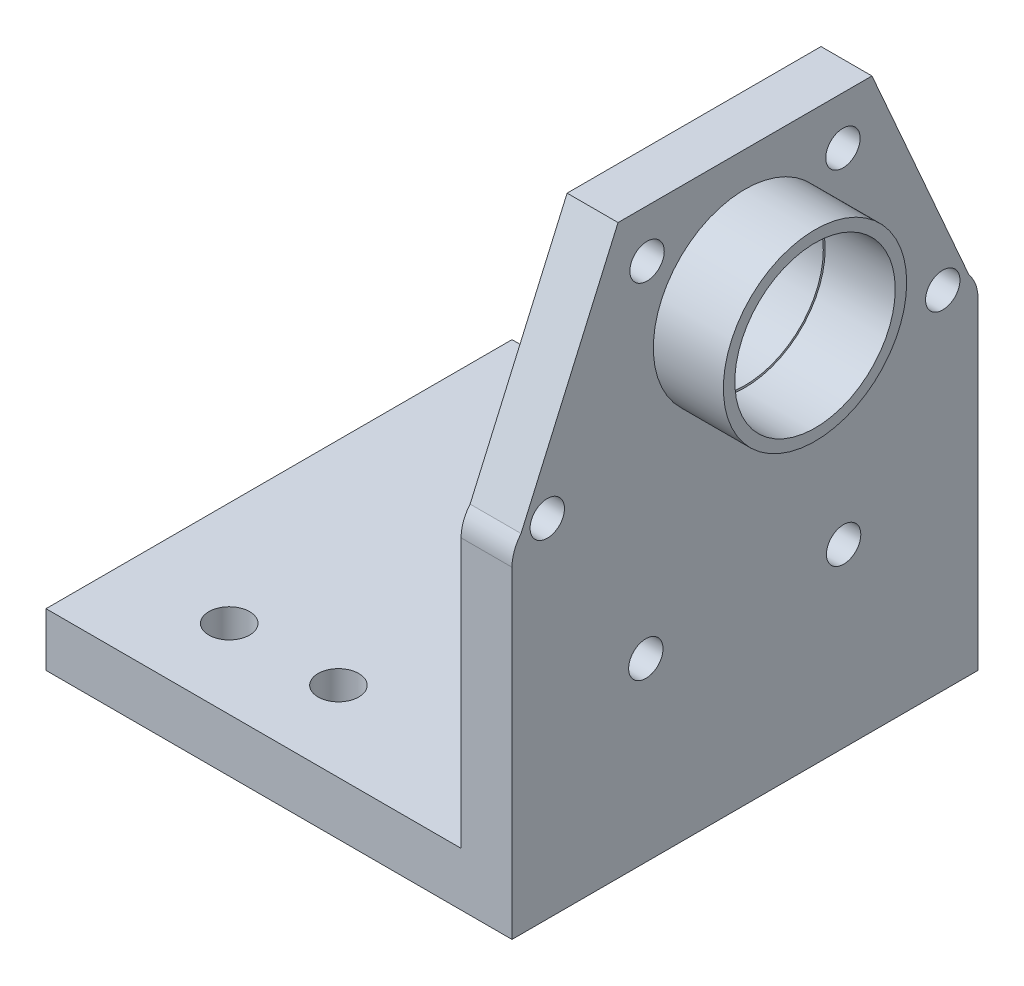
ISO-10303-21;
HEADER;
FILE_DESCRIPTION(('STEP AP214'),'2;1');
FILE_NAME('part.step','',(''),(''),'','','');
FILE_SCHEMA(('AUTOMOTIVE_DESIGN { 1 0 10303 214 1 1 1 1 }'));
ENDSEC;
DATA;
#1=APPLICATION_CONTEXT('core data for automotive mechanical design processes');
#2=APPLICATION_PROTOCOL_DEFINITION('international standard','automotive_design',2000,#1);
#3=PRODUCT_CONTEXT('',#1,'mechanical');
#4=PRODUCT('Part','Part','',(#3));
#5=PRODUCT_RELATED_PRODUCT_CATEGORY('part','',(#4));
#6=PRODUCT_DEFINITION_FORMATION('','',#4);
#7=PRODUCT_DEFINITION_CONTEXT('part definition',#1,'design');
#8=PRODUCT_DEFINITION('design','',#6,#7);
#9=PRODUCT_DEFINITION_SHAPE('','',#8);
#10=(LENGTH_UNIT() NAMED_UNIT(*) SI_UNIT(.MILLI.,.METRE.));
#11=(NAMED_UNIT(*) PLANE_ANGLE_UNIT() SI_UNIT($,.RADIAN.));
#12=(NAMED_UNIT(*) SI_UNIT($,.STERADIAN.) SOLID_ANGLE_UNIT());
#13=UNCERTAINTY_MEASURE_WITH_UNIT(LENGTH_MEASURE(1.E-05),#10,'distance_accuracy_value','');
#14=(GEOMETRIC_REPRESENTATION_CONTEXT(3) GLOBAL_UNCERTAINTY_ASSIGNED_CONTEXT((#13)) GLOBAL_UNIT_ASSIGNED_CONTEXT((#10,
#11,#12)) REPRESENTATION_CONTEXT('',''));
#15=CARTESIAN_POINT('',(0.,0.,0.));
#16=DIRECTION('',(0.,0.,1.));
#17=DIRECTION('',(1.,0.,0.));
#18=AXIS2_PLACEMENT_3D('',#15,#16,#17);
#19=CARTESIAN_POINT('',(18.3,-4.,18.3));
#20=DIRECTION('',(1.,0.,0.));
#21=DIRECTION('',(0.,0.,-1.));
#22=AXIS2_PLACEMENT_3D('',#19,#20,#21);
#23=PLANE('',#22);
#24=CARTESIAN_POINT('',(18.3,30.6829031479731,0.));
#25=DIRECTION('',(1.,0.,0.));
#26=DIRECTION('',(0.,0.,-1.));
#27=AXIS2_PLACEMENT_3D('',#24,#25,#26);
#28=CIRCLE('',#27,7.2);
#29=CARTESIAN_POINT('',(18.3,30.6829031479731,-7.2));
#30=VERTEX_POINT('',#29);
#31=EDGE_CURVE('E376',#30,#30,#28,.T.);
#32=ORIENTED_EDGE('',*,*,#31,.F.);
#33=EDGE_LOOP('',(#32));
#34=FACE_BOUND('',#33,.T.);
#35=DIRECTION('',(0.,1.,0.));
#36=VECTOR('',#35,1.);
#37=CARTESIAN_POINT('',(18.3,-4.,-18.3));
#38=LINE('',#37,#36);
#39=CARTESIAN_POINT('',(18.3,-4.,-18.3));
#40=VERTEX_POINT('',#39);
#41=CARTESIAN_POINT('',(18.3,21.3190166297817,-18.3));
#42=VERTEX_POINT('',#41);
#43=EDGE_CURVE('E226',#40,#42,#38,.T.);
#44=ORIENTED_EDGE('',*,*,#43,.T.);
#45=CARTESIAN_POINT('',(18.3,21.3190166297817,-15.3));
#46=DIRECTION('',(1.,0.,0.));
#47=DIRECTION('',(0.,0.,-1.));
#48=AXIS2_PLACEMENT_3D('',#45,#46,#47);
#49=CIRCLE('',#48,3.);
#50=CARTESIAN_POINT('',(18.3,23.2570443214554,-17.5899887917424));
#51=VERTEX_POINT('',#50);
#52=EDGE_CURVE('E47',#42,#51,#49,.T.);
#53=ORIENTED_EDGE('',*,*,#52,.T.);
#54=DIRECTION('',(0.,-0.915557873016181,-0.402186251826298));
#55=VECTOR('',#54,1.);
#56=CARTESIAN_POINT('',(18.3,23.2570443214554,-17.5899887917424));
#57=LINE('',#56,#55);
#58=CARTESIAN_POINT('',(18.3,40.6,-9.97157542267274));
#59=VERTEX_POINT('',#58);
#60=EDGE_CURVE('E141',#59,#51,#57,.T.);
#61=ORIENTED_EDGE('',*,*,#60,.F.);
#62=DIRECTION('',(0.,0.,-1.));
#63=VECTOR('',#62,1.);
#64=CARTESIAN_POINT('',(18.3,40.6,18.3));
#65=LINE('',#64,#63);
#66=CARTESIAN_POINT('',(18.3,40.6,9.97157542267274));
#67=VERTEX_POINT('',#66);
#68=EDGE_CURVE('E140',#67,#59,#65,.T.);
#69=ORIENTED_EDGE('',*,*,#68,.F.);
#70=DIRECTION('',(0.,0.915557873016181,-0.402186251826298));
#71=VECTOR('',#70,1.);
#72=CARTESIAN_POINT('',(18.3,36.8329031479731,11.6263856840843));
#73=LINE('',#72,#71);
#74=CARTESIAN_POINT('',(18.3,23.2570443214554,17.5899887917424));
#75=VERTEX_POINT('',#74);
#76=EDGE_CURVE('E129',#75,#67,#73,.T.);
#77=ORIENTED_EDGE('',*,*,#76,.F.);
#78=CARTESIAN_POINT('',(18.3,21.3190166297817,15.3));
#79=DIRECTION('',(1.,0.,0.));
#80=DIRECTION('',(0.,0.,-1.));
#81=AXIS2_PLACEMENT_3D('',#78,#79,#80);
#82=CIRCLE('',#81,3.);
#83=CARTESIAN_POINT('',(18.3,21.3190166297817,18.3));
#84=VERTEX_POINT('',#83);
#85=EDGE_CURVE('E115',#75,#84,#82,.T.);
#86=ORIENTED_EDGE('',*,*,#85,.T.);
#87=DIRECTION('',(0.,1.,0.));
#88=VECTOR('',#87,1.);
#89=CARTESIAN_POINT('',(18.3,-4.,18.3));
#90=LINE('',#89,#88);
#91=CARTESIAN_POINT('',(18.3,-4.,18.3));
#92=VERTEX_POINT('',#91);
#93=EDGE_CURVE('E228',#92,#84,#90,.T.);
#94=ORIENTED_EDGE('',*,*,#93,.F.);
#95=DIRECTION('',(0.,0.,-1.));
#96=VECTOR('',#95,1.);
#97=CARTESIAN_POINT('',(18.3,-4.,18.3));
#98=LINE('',#97,#96);
#99=EDGE_CURVE('E217',#92,#40,#98,.T.);
#100=ORIENTED_EDGE('',*,*,#99,.T.);
#101=EDGE_LOOP('',(#44,#53,#61,#69,#77,#86,#94,#100));
#102=FACE_BOUND('',#101,.T.);
#103=CARTESIAN_POINT('',(18.3,9.85104244990388,7.79001879418784));
#104=DIRECTION('',(1.,0.,0.));
#105=DIRECTION('',(0.,0.,-1.));
#106=AXIS2_PLACEMENT_3D('',#103,#104,#105);
#107=CIRCLE('',#106,1.35);
#108=CARTESIAN_POINT('',(18.3,9.85104244990388,6.44001879418784));
#109=VERTEX_POINT('',#108);
#110=EDGE_CURVE('E187',#109,#109,#107,.T.);
#111=ORIENTED_EDGE('',*,*,#110,.F.);
#112=EDGE_LOOP('',(#111));
#113=FACE_BOUND('',#112,.T.);
#114=CARTESIAN_POINT('',(18.3,9.85104244990387,-7.74523523434163));
#115=DIRECTION('',(1.,0.,0.));
#116=DIRECTION('',(0.,0.,-1.));
#117=AXIS2_PLACEMENT_3D('',#114,#115,#116);
#118=CIRCLE('',#117,1.35);
#119=CARTESIAN_POINT('',(18.3,9.85104244990387,-9.09523523434163));
#120=VERTEX_POINT('',#119);
#121=EDGE_CURVE('E184',#120,#120,#118,.T.);
#122=ORIENTED_EDGE('',*,*,#121,.F.);
#123=EDGE_LOOP('',(#122));
#124=FACE_BOUND('',#123,.T.);
#125=CARTESIAN_POINT('',(18.3,23.2570443214554,-15.5299775834848));
#126=DIRECTION('',(1.,0.,0.));
#127=DIRECTION('',(0.,0.,-1.));
#128=AXIS2_PLACEMENT_3D('',#125,#126,#127);
#129=CIRCLE('',#128,1.35);
#130=CARTESIAN_POINT('',(18.3,23.2570443214554,-16.8799775834848));
#131=VERTEX_POINT('',#130);
#132=EDGE_CURVE('E181',#131,#131,#129,.T.);
#133=ORIENTED_EDGE('',*,*,#132,.F.);
#134=EDGE_LOOP('',(#133));
#135=FACE_BOUND('',#134,.T.);
#136=CARTESIAN_POINT('',(18.3,36.8329031479731,7.69195183551449));
#137=DIRECTION('',(1.,0.,0.));
#138=DIRECTION('',(0.,0.,-1.));
#139=AXIS2_PLACEMENT_3D('',#136,#137,#138);
#140=CIRCLE('',#139,1.35);
#141=CARTESIAN_POINT('',(18.3,36.8329031479731,6.34195183551449));
#142=VERTEX_POINT('',#141);
#143=EDGE_CURVE('E171',#142,#142,#140,.T.);
#144=ORIENTED_EDGE('',*,*,#143,.F.);
#145=EDGE_LOOP('',(#144));
#146=FACE_BOUND('',#145,.T.);
#147=CARTESIAN_POINT('',(18.3,23.2570443214554,15.5299775834848));
#148=DIRECTION('',(1.,0.,0.));
#149=DIRECTION('',(0.,0.,-1.));
#150=AXIS2_PLACEMENT_3D('',#147,#148,#149);
#151=CIRCLE('',#150,1.35);
#152=CARTESIAN_POINT('',(18.3,23.2570443214554,14.1799775834848));
#153=VERTEX_POINT('',#152);
#154=EDGE_CURVE('E175',#153,#153,#151,.T.);
#155=ORIENTED_EDGE('',*,*,#154,.F.);
#156=EDGE_LOOP('',(#155));
#157=FACE_BOUND('',#156,.T.);
#158=CARTESIAN_POINT('',(18.3,36.8329031479731,-7.69195183551449));
#159=DIRECTION('',(1.,0.,0.));
#160=DIRECTION('',(0.,0.,-1.));
#161=AXIS2_PLACEMENT_3D('',#158,#159,#160);
#162=CIRCLE('',#161,1.35);
#163=CARTESIAN_POINT('',(18.3,36.8329031479731,-9.04195183551449));
#164=VERTEX_POINT('',#163);
#165=EDGE_CURVE('E178',#164,#164,#162,.F.);
#166=ORIENTED_EDGE('',*,*,#165,.T.);
#167=EDGE_LOOP('',(#166));
#168=FACE_BOUND('',#167,.T.);
#169=ADVANCED_FACE('F39',(#34,#102,#113,#124,#135,#146,#157,#168),#23,.T.);
#170=CARTESIAN_POINT('',(14.3,0.200000000000006,-18.3));
#171=DIRECTION('',(1.,0.,0.));
#172=DIRECTION('',(0.,0.,-1.));
#173=AXIS2_PLACEMENT_3D('',#170,#171,#172);
#174=PLANE('',#173);
#175=CARTESIAN_POINT('',(14.3,9.85104244990388,7.79001879418784));
#176=DIRECTION('',(1.,0.,0.));
#177=DIRECTION('',(0.,0.,-1.));
#178=AXIS2_PLACEMENT_3D('',#175,#176,#177);
#179=CIRCLE('',#178,1.35);
#180=CARTESIAN_POINT('',(14.3,9.85104244990388,6.44001879418784));
#181=VERTEX_POINT('',#180);
#182=EDGE_CURVE('E205',#181,#181,#179,.T.);
#183=ORIENTED_EDGE('',*,*,#182,.T.);
#184=EDGE_LOOP('',(#183));
#185=FACE_BOUND('',#184,.T.);
#186=CARTESIAN_POINT('',(14.3,9.85104244990387,-7.74523523434163));
#187=DIRECTION('',(1.,0.,0.));
#188=DIRECTION('',(0.,0.,-1.));
#189=AXIS2_PLACEMENT_3D('',#186,#187,#188);
#190=CIRCLE('',#189,1.35);
#191=CARTESIAN_POINT('',(14.3,9.85104244990387,-9.09523523434163));
#192=VERTEX_POINT('',#191);
#193=EDGE_CURVE('E246',#192,#192,#190,.T.);
#194=ORIENTED_EDGE('',*,*,#193,.T.);
#195=EDGE_LOOP('',(#194));
#196=FACE_BOUND('',#195,.T.);
#197=CARTESIAN_POINT('',(14.3,23.2570443214554,-15.5299775834848));
#198=DIRECTION('',(1.,0.,0.));
#199=DIRECTION('',(0.,0.,-1.));
#200=AXIS2_PLACEMENT_3D('',#197,#198,#199);
#201=CIRCLE('',#200,1.35);
#202=CARTESIAN_POINT('',(14.3,23.2570443214554,-16.8799775834848));
#203=VERTEX_POINT('',#202);
#204=EDGE_CURVE('E243',#203,#203,#201,.T.);
#205=ORIENTED_EDGE('',*,*,#204,.T.);
#206=EDGE_LOOP('',(#205));
#207=FACE_BOUND('',#206,.T.);
#208=CARTESIAN_POINT('',(14.3,23.2570443214554,15.5299775834848));
#209=DIRECTION('',(1.,0.,0.));
#210=DIRECTION('',(0.,0.,-1.));
#211=AXIS2_PLACEMENT_3D('',#208,#209,#210);
#212=CIRCLE('',#211,1.35);
#213=CARTESIAN_POINT('',(14.3,23.2570443214554,14.1799775834848));
#214=VERTEX_POINT('',#213);
#215=EDGE_CURVE('E237',#214,#214,#212,.T.);
#216=ORIENTED_EDGE('',*,*,#215,.T.);
#217=EDGE_LOOP('',(#216));
#218=FACE_BOUND('',#217,.T.);
#219=CARTESIAN_POINT('',(14.3,36.8329031479731,7.69195183551449));
#220=DIRECTION('',(1.,0.,0.));
#221=DIRECTION('',(0.,0.,-1.));
#222=AXIS2_PLACEMENT_3D('',#219,#220,#221);
#223=CIRCLE('',#222,1.35);
#224=CARTESIAN_POINT('',(14.3,36.8329031479731,6.34195183551449));
#225=VERTEX_POINT('',#224);
#226=EDGE_CURVE('E234',#225,#225,#223,.T.);
#227=ORIENTED_EDGE('',*,*,#226,.T.);
#228=EDGE_LOOP('',(#227));
#229=FACE_BOUND('',#228,.T.);
#230=CARTESIAN_POINT('',(14.3,30.6829031479731,0.));
#231=DIRECTION('',(1.,0.,0.));
#232=DIRECTION('',(0.,0.,-1.));
#233=AXIS2_PLACEMENT_3D('',#230,#231,#232);
#234=CIRCLE('',#233,6.15);
#235=CARTESIAN_POINT('',(14.3,30.6829031479731,-6.15));
#236=VERTEX_POINT('',#235);
#237=EDGE_CURVE('E174',#236,#236,#234,.T.);
#238=ORIENTED_EDGE('',*,*,#237,.T.);
#239=EDGE_LOOP('',(#238));
#240=FACE_BOUND('',#239,.T.);
#241=DIRECTION('',(0.,-0.915557873016181,-0.402186251826298));
#242=VECTOR('',#241,1.);
#243=CARTESIAN_POINT('',(14.3,3.66812037377902,-26.1950110759942));
#244=LINE('',#243,#242);
#245=CARTESIAN_POINT('',(14.3,40.6,-9.97157542267274));
#246=VERTEX_POINT('',#245);
#247=CARTESIAN_POINT('',(14.3,23.2570443214554,-17.5899887917424));
#248=VERTEX_POINT('',#247);
#249=EDGE_CURVE('E150',#246,#248,#244,.T.);
#250=ORIENTED_EDGE('',*,*,#249,.T.);
#251=CARTESIAN_POINT('',(14.3,21.3190166297817,-15.3));
#252=DIRECTION('',(1.,0.,0.));
#253=DIRECTION('',(0.,0.,-1.));
#254=AXIS2_PLACEMENT_3D('',#251,#252,#253);
#255=CIRCLE('',#254,3.);
#256=CARTESIAN_POINT('',(14.3,21.3190166297817,-18.3));
#257=VERTEX_POINT('',#256);
#258=EDGE_CURVE('E11',#248,#257,#255,.F.);
#259=ORIENTED_EDGE('',*,*,#258,.T.);
#260=DIRECTION('',(0.,1.,0.));
#261=VECTOR('',#260,1.);
#262=CARTESIAN_POINT('',(14.3,0.200000000000006,-18.3));
#263=LINE('',#262,#261);
#264=CARTESIAN_POINT('',(14.3,0.200000000000006,-18.3));
#265=VERTEX_POINT('',#264);
#266=EDGE_CURVE('E206',#265,#257,#263,.T.);
#267=ORIENTED_EDGE('',*,*,#266,.F.);
#268=DIRECTION('',(0.,0.,-1.));
#269=VECTOR('',#268,1.);
#270=CARTESIAN_POINT('',(14.3,0.200000000000006,-18.3));
#271=LINE('',#270,#269);
#272=CARTESIAN_POINT('',(14.3,0.200000000000006,18.3));
#273=VERTEX_POINT('',#272);
#274=EDGE_CURVE('E197',#273,#265,#271,.T.);
#275=ORIENTED_EDGE('',*,*,#274,.F.);
#276=DIRECTION('',(0.,1.,0.));
#277=VECTOR('',#276,1.);
#278=CARTESIAN_POINT('',(14.3,0.200000000000006,18.3));
#279=LINE('',#278,#277);
#280=CARTESIAN_POINT('',(14.3,21.3190166297817,18.3));
#281=VERTEX_POINT('',#280);
#282=EDGE_CURVE('E202',#273,#281,#279,.T.);
#283=ORIENTED_EDGE('',*,*,#282,.T.);
#284=CARTESIAN_POINT('',(14.3,21.3190166297817,15.3));
#285=DIRECTION('',(1.,0.,0.));
#286=DIRECTION('',(0.,0.,-1.));
#287=AXIS2_PLACEMENT_3D('',#284,#285,#286);
#288=CIRCLE('',#287,3.);
#289=CARTESIAN_POINT('',(14.3,23.2570443214554,17.5899887917424));
#290=VERTEX_POINT('',#289);
#291=EDGE_CURVE('E262',#281,#290,#288,.F.);
#292=ORIENTED_EDGE('',*,*,#291,.T.);
#293=DIRECTION('',(0.,0.915557873016181,-0.402186251826298));
#294=VECTOR('',#293,1.);
#295=CARTESIAN_POINT('',(14.3,17.1451476613698,20.2748226856082));
#296=LINE('',#295,#294);
#297=CARTESIAN_POINT('',(14.3,40.6,9.97157542267274));
#298=VERTEX_POINT('',#297);
#299=EDGE_CURVE('E132',#290,#298,#296,.T.);
#300=ORIENTED_EDGE('',*,*,#299,.T.);
#301=DIRECTION('',(0.,0.,-1.));
#302=VECTOR('',#301,1.);
#303=CARTESIAN_POINT('',(14.3,40.6,-18.3));
#304=LINE('',#303,#302);
#305=EDGE_CURVE('E194',#298,#246,#304,.T.);
#306=ORIENTED_EDGE('',*,*,#305,.T.);
#307=EDGE_LOOP('',(#250,#259,#267,#275,#283,#292,#300,#306));
#308=FACE_BOUND('',#307,.T.);
#309=CARTESIAN_POINT('',(14.3,36.8329031479731,-7.69195183551449));
#310=DIRECTION('',(1.,0.,0.));
#311=DIRECTION('',(0.,0.,-1.));
#312=AXIS2_PLACEMENT_3D('',#309,#310,#311);
#313=CIRCLE('',#312,1.35);
#314=CARTESIAN_POINT('',(14.3,36.8329031479731,-9.04195183551449));
#315=VERTEX_POINT('',#314);
#316=EDGE_CURVE('E240',#315,#315,#313,.F.);
#317=ORIENTED_EDGE('',*,*,#316,.F.);
#318=EDGE_LOOP('',(#317));
#319=FACE_BOUND('',#318,.T.);
#320=ADVANCED_FACE('F271',(#185,#196,#207,#218,#229,#240,#308,#319),#174,.F.);
#321=CARTESIAN_POINT('',(-18.3,-4.,18.3));
#322=DIRECTION('',(-1.,0.,0.));
#323=DIRECTION('',(0.,0.,1.));
#324=AXIS2_PLACEMENT_3D('',#321,#322,#323);
#325=PLANE('',#324);
#326=DIRECTION('',(0.,1.,0.));
#327=VECTOR('',#326,1.);
#328=CARTESIAN_POINT('',(-18.3,-4.,18.3));
#329=LINE('',#328,#327);
#330=CARTESIAN_POINT('',(-18.3,-4.,18.3));
#331=VERTEX_POINT('',#330);
#332=CARTESIAN_POINT('',(-18.3,0.200000000000006,18.3));
#333=VERTEX_POINT('',#332);
#334=EDGE_CURVE('E223',#331,#333,#329,.T.);
#335=ORIENTED_EDGE('',*,*,#334,.T.);
#336=DIRECTION('',(0.,0.,1.));
#337=VECTOR('',#336,1.);
#338=CARTESIAN_POINT('',(-18.3,0.200000000000006,-18.3));
#339=LINE('',#338,#337);
#340=CARTESIAN_POINT('',(-18.3,0.200000000000006,-18.3));
#341=VERTEX_POINT('',#340);
#342=EDGE_CURVE('E191',#341,#333,#339,.T.);
#343=ORIENTED_EDGE('',*,*,#342,.F.);
#344=DIRECTION('',(0.,1.,0.));
#345=VECTOR('',#344,1.);
#346=CARTESIAN_POINT('',(-18.3,-4.,-18.3));
#347=LINE('',#346,#345);
#348=CARTESIAN_POINT('',(-18.3,-4.,-18.3));
#349=VERTEX_POINT('',#348);
#350=EDGE_CURVE('E124',#349,#341,#347,.T.);
#351=ORIENTED_EDGE('',*,*,#350,.F.);
#352=DIRECTION('',(0.,0.,1.));
#353=VECTOR('',#352,1.);
#354=CARTESIAN_POINT('',(-18.3,-4.,18.3));
#355=LINE('',#354,#353);
#356=EDGE_CURVE('E211',#349,#331,#355,.T.);
#357=ORIENTED_EDGE('',*,*,#356,.T.);
#358=EDGE_LOOP('',(#335,#343,#351,#357));
#359=FACE_BOUND('',#358,.T.);
#360=ADVANCED_FACE('F306',(#359),#325,.T.);
#361=CARTESIAN_POINT('',(18.3,-4.,-18.3));
#362=DIRECTION('',(0.,0.,-1.));
#363=DIRECTION('',(-1.,0.,0.));
#364=AXIS2_PLACEMENT_3D('',#361,#362,#363);
#365=PLANE('',#364);
#366=ORIENTED_EDGE('',*,*,#266,.T.);
#367=DIRECTION('',(1.,0.,0.));
#368=VECTOR('',#367,1.);
#369=CARTESIAN_POINT('',(18.3,21.3190166297817,-18.3));
#370=LINE('',#369,#368);
#371=EDGE_CURVE('E264',#257,#42,#370,.T.);
#372=ORIENTED_EDGE('',*,*,#371,.T.);
#373=ORIENTED_EDGE('',*,*,#43,.F.);
#374=DIRECTION('',(-1.,0.,0.));
#375=VECTOR('',#374,1.);
#376=CARTESIAN_POINT('',(18.3,-4.,-18.3));
#377=LINE('',#376,#375);
#378=EDGE_CURVE('E220',#40,#349,#377,.T.);
#379=ORIENTED_EDGE('',*,*,#378,.T.);
#380=ORIENTED_EDGE('',*,*,#350,.T.);
#381=DIRECTION('',(-1.,0.,0.));
#382=VECTOR('',#381,1.);
#383=CARTESIAN_POINT('',(-18.3,0.200000000000006,-18.3));
#384=LINE('',#383,#382);
#385=EDGE_CURVE('E200',#265,#341,#384,.T.);
#386=ORIENTED_EDGE('',*,*,#385,.F.);
#387=EDGE_LOOP('',(#366,#372,#373,#379,#380,#386));
#388=FACE_BOUND('',#387,.T.);
#389=ADVANCED_FACE('F269',(#388),#365,.T.);
#390=CARTESIAN_POINT('',(18.3,-4.,18.3));
#391=DIRECTION('',(0.,0.,1.));
#392=DIRECTION('',(1.,0.,0.));
#393=AXIS2_PLACEMENT_3D('',#390,#391,#392);
#394=PLANE('',#393);
#395=ORIENTED_EDGE('',*,*,#93,.T.);
#396=DIRECTION('',(-1.,0.,0.));
#397=VECTOR('',#396,1.);
#398=CARTESIAN_POINT('',(14.3,21.3190166297817,18.3));
#399=LINE('',#398,#397);
#400=EDGE_CURVE('E120',#84,#281,#399,.T.);
#401=ORIENTED_EDGE('',*,*,#400,.T.);
#402=ORIENTED_EDGE('',*,*,#282,.F.);
#403=DIRECTION('',(1.,0.,0.));
#404=VECTOR('',#403,1.);
#405=CARTESIAN_POINT('',(-18.3,0.200000000000006,18.3));
#406=LINE('',#405,#404);
#407=EDGE_CURVE('E193',#333,#273,#406,.T.);
#408=ORIENTED_EDGE('',*,*,#407,.F.);
#409=ORIENTED_EDGE('',*,*,#334,.F.);
#410=DIRECTION('',(1.,0.,0.));
#411=VECTOR('',#410,1.);
#412=CARTESIAN_POINT('',(18.3,-4.,18.3));
#413=LINE('',#412,#411);
#414=EDGE_CURVE('E214',#331,#92,#413,.T.);
#415=ORIENTED_EDGE('',*,*,#414,.T.);
#416=EDGE_LOOP('',(#395,#401,#402,#408,#409,#415));
#417=FACE_BOUND('',#416,.T.);
#418=ADVANCED_FACE('F279',(#417),#394,.T.);
#419=CARTESIAN_POINT('',(0.,-4.,0.));
#420=DIRECTION('',(0.,1.,0.));
#421=DIRECTION('',(0.,0.,1.));
#422=AXIS2_PLACEMENT_3D('',#419,#420,#421);
#423=PLANE('',#422);
#424=CARTESIAN_POINT('',(-1.60693551192598,-4.,12.025));
#425=DIRECTION('',(0.,-1.,0.));
#426=DIRECTION('',(0.,0.,1.));
#427=AXIS2_PLACEMENT_3D('',#424,#425,#426);
#428=CIRCLE('',#427,1.6);
#429=CARTESIAN_POINT('',(-1.60693551192598,-4.,13.625));
#430=VERTEX_POINT('',#429);
#431=EDGE_CURVE('E158',#430,#430,#428,.T.);
#432=ORIENTED_EDGE('',*,*,#431,.F.);
#433=EDGE_LOOP('',(#432));
#434=FACE_BOUND('',#433,.T.);
#435=CARTESIAN_POINT('',(-10.106572894405,-4.,12.1035134788744));
#436=DIRECTION('',(0.,-1.,0.));
#437=DIRECTION('',(0.,0.,1.));
#438=AXIS2_PLACEMENT_3D('',#435,#436,#437);
#439=CIRCLE('',#438,1.6);
#440=CARTESIAN_POINT('',(-10.106572894405,-4.,13.7035134788744));
#441=VERTEX_POINT('',#440);
#442=EDGE_CURVE('E163',#441,#441,#439,.T.);
#443=ORIENTED_EDGE('',*,*,#442,.F.);
#444=EDGE_LOOP('',(#443));
#445=FACE_BOUND('',#444,.T.);
#446=CARTESIAN_POINT('',(-10.106572894405,-4.,-12.1035134788744));
#447=DIRECTION('',(0.,-1.,0.));
#448=DIRECTION('',(0.,0.,-1.));
#449=AXIS2_PLACEMENT_3D('',#446,#447,#448);
#450=CIRCLE('',#449,1.6);
#451=CARTESIAN_POINT('',(-10.106572894405,-4.,-13.7035134788744));
#452=VERTEX_POINT('',#451);
#453=EDGE_CURVE('E159',#452,#452,#450,.T.);
#454=ORIENTED_EDGE('',*,*,#453,.F.);
#455=EDGE_LOOP('',(#454));
#456=FACE_BOUND('',#455,.T.);
#457=CARTESIAN_POINT('',(-1.60693551192598,-4.,-12.025));
#458=DIRECTION('',(0.,-1.,0.));
#459=DIRECTION('',(0.,0.,-1.));
#460=AXIS2_PLACEMENT_3D('',#457,#458,#459);
#461=CIRCLE('',#460,1.6);
#462=CARTESIAN_POINT('',(-1.60693551192598,-4.,-13.625));
#463=VERTEX_POINT('',#462);
#464=EDGE_CURVE('E162',#463,#463,#461,.T.);
#465=ORIENTED_EDGE('',*,*,#464,.F.);
#466=EDGE_LOOP('',(#465));
#467=FACE_BOUND('',#466,.T.);
#468=ORIENTED_EDGE('',*,*,#356,.F.);
#469=ORIENTED_EDGE('',*,*,#378,.F.);
#470=ORIENTED_EDGE('',*,*,#99,.F.);
#471=ORIENTED_EDGE('',*,*,#414,.F.);
#472=EDGE_LOOP('',(#468,#469,#470,#471));
#473=FACE_BOUND('',#472,.T.);
#474=ADVANCED_FACE('F284',(#434,#445,#456,#467,#473),#423,.F.);
#475=CARTESIAN_POINT('',(0.,40.6,0.));
#476=DIRECTION('',(0.,1.,0.));
#477=DIRECTION('',(0.,0.,1.));
#478=AXIS2_PLACEMENT_3D('',#475,#476,#477);
#479=PLANE('',#478);
#480=DIRECTION('',(1.,0.,0.));
#481=VECTOR('',#480,1.);
#482=CARTESIAN_POINT('',(8.3,40.6,9.97157542267274));
#483=LINE('',#482,#481);
#484=EDGE_CURVE('E133',#298,#67,#483,.T.);
#485=ORIENTED_EDGE('',*,*,#484,.T.);
#486=ORIENTED_EDGE('',*,*,#68,.T.);
#487=DIRECTION('',(1.,0.,0.));
#488=VECTOR('',#487,1.);
#489=CARTESIAN_POINT('',(8.3,40.6,-9.97157542267274));
#490=LINE('',#489,#488);
#491=EDGE_CURVE('E144',#246,#59,#490,.T.);
#492=ORIENTED_EDGE('',*,*,#491,.F.);
#493=ORIENTED_EDGE('',*,*,#305,.F.);
#494=EDGE_LOOP('',(#485,#486,#492,#493));
#495=FACE_BOUND('',#494,.T.);
#496=ADVANCED_FACE('F282',(#495),#479,.T.);
#497=CARTESIAN_POINT('',(0.,0.200000000000006,0.));
#498=DIRECTION('',(0.,1.,0.));
#499=DIRECTION('',(0.,0.,1.));
#500=AXIS2_PLACEMENT_3D('',#497,#498,#499);
#501=PLANE('',#500);
#502=CARTESIAN_POINT('',(-1.60693551192598,0.200000000000006,12.025));
#503=DIRECTION('',(0.,1.,0.));
#504=DIRECTION('',(0.,0.,1.));
#505=AXIS2_PLACEMENT_3D('',#502,#503,#504);
#506=CIRCLE('',#505,1.6);
#507=CARTESIAN_POINT('',(-1.60693551192598,0.200000000000006,13.625));
#508=VERTEX_POINT('',#507);
#509=EDGE_CURVE('E190',#508,#508,#506,.T.);
#510=ORIENTED_EDGE('',*,*,#509,.F.);
#511=EDGE_LOOP('',(#510));
#512=FACE_BOUND('',#511,.T.);
#513=CARTESIAN_POINT('',(-10.106572894405,0.200000000000006,12.1035134788744));
#514=DIRECTION('',(0.,1.,0.));
#515=DIRECTION('',(0.,0.,1.));
#516=AXIS2_PLACEMENT_3D('',#513,#514,#515);
#517=CIRCLE('',#516,1.6);
#518=CARTESIAN_POINT('',(-10.106572894405,0.200000000000006,13.7035134788744));
#519=VERTEX_POINT('',#518);
#520=EDGE_CURVE('E256',#519,#519,#517,.T.);
#521=ORIENTED_EDGE('',*,*,#520,.F.);
#522=EDGE_LOOP('',(#521));
#523=FACE_BOUND('',#522,.T.);
#524=CARTESIAN_POINT('',(-10.106572894405,0.200000000000006,-12.1035134788744));
#525=DIRECTION('',(0.,1.,0.));
#526=DIRECTION('',(0.,0.,1.));
#527=AXIS2_PLACEMENT_3D('',#524,#525,#526);
#528=CIRCLE('',#527,1.6);
#529=CARTESIAN_POINT('',(-10.106572894405,0.200000000000006,-10.5035134788744));
#530=VERTEX_POINT('',#529);
#531=EDGE_CURVE('E253',#530,#530,#528,.T.);
#532=ORIENTED_EDGE('',*,*,#531,.F.);
#533=EDGE_LOOP('',(#532));
#534=FACE_BOUND('',#533,.T.);
#535=CARTESIAN_POINT('',(-1.60693551192598,0.200000000000006,-12.025));
#536=DIRECTION('',(0.,1.,0.));
#537=DIRECTION('',(0.,0.,1.));
#538=AXIS2_PLACEMENT_3D('',#535,#536,#537);
#539=CIRCLE('',#538,1.6);
#540=CARTESIAN_POINT('',(-1.60693551192598,0.200000000000006,-10.425));
#541=VERTEX_POINT('',#540);
#542=EDGE_CURVE('E170',#541,#541,#539,.T.);
#543=ORIENTED_EDGE('',*,*,#542,.F.);
#544=EDGE_LOOP('',(#543));
#545=FACE_BOUND('',#544,.T.);
#546=ORIENTED_EDGE('',*,*,#342,.T.);
#547=ORIENTED_EDGE('',*,*,#407,.T.);
#548=ORIENTED_EDGE('',*,*,#274,.T.);
#549=ORIENTED_EDGE('',*,*,#385,.T.);
#550=EDGE_LOOP('',(#546,#547,#548,#549));
#551=FACE_BOUND('',#550,.T.);
#552=ADVANCED_FACE('F274',(#512,#523,#534,#545,#551),#501,.T.);
#553=CARTESIAN_POINT('',(-18.3,30.6829031479731,0.));
#554=DIRECTION('',(1.,0.,0.));
#555=DIRECTION('',(0.,0.,-1.));
#556=AXIS2_PLACEMENT_3D('',#553,#554,#555);
#557=CYLINDRICAL_SURFACE('',#556,6.15);
#558=CARTESIAN_POINT('',(18.3,30.6829031479731,0.));
#559=DIRECTION('',(1.,0.,0.));
#560=DIRECTION('',(0.,0.,-1.));
#561=AXIS2_PLACEMENT_3D('',#558,#559,#560);
#562=CIRCLE('',#561,6.15);
#563=CARTESIAN_POINT('',(18.3,30.6829031479731,-6.15));
#564=VERTEX_POINT('',#563);
#565=EDGE_CURVE('E148',#564,#564,#562,.F.);
#566=ORIENTED_EDGE('',*,*,#565,.F.);
#567=EDGE_LOOP('',(#566));
#568=FACE_BOUND('',#567,.T.);
#569=ORIENTED_EDGE('',*,*,#237,.F.);
#570=EDGE_LOOP('',(#569));
#571=FACE_BOUND('',#570,.T.);
#572=ADVANCED_FACE('F291',(#568,#571),#557,.F.);
#573=CARTESIAN_POINT('',(-18.3,36.8329031479731,7.69195183551449));
#574=DIRECTION('',(1.,0.,0.));
#575=DIRECTION('',(0.,0.,-1.));
#576=AXIS2_PLACEMENT_3D('',#573,#574,#575);
#577=CYLINDRICAL_SURFACE('',#576,1.35);
#578=ORIENTED_EDGE('',*,*,#143,.T.);
#579=EDGE_LOOP('',(#578));
#580=FACE_BOUND('',#579,.T.);
#581=ORIENTED_EDGE('',*,*,#226,.F.);
#582=EDGE_LOOP('',(#581));
#583=FACE_BOUND('',#582,.T.);
#584=ADVANCED_FACE('F343',(#580,#583),#577,.F.);
#585=CARTESIAN_POINT('',(-18.3,23.2570443214554,15.5299775834848));
#586=DIRECTION('',(1.,0.,0.));
#587=DIRECTION('',(0.,0.,-1.));
#588=AXIS2_PLACEMENT_3D('',#585,#586,#587);
#589=CYLINDRICAL_SURFACE('',#588,1.35);
#590=ORIENTED_EDGE('',*,*,#154,.T.);
#591=EDGE_LOOP('',(#590));
#592=FACE_BOUND('',#591,.T.);
#593=ORIENTED_EDGE('',*,*,#215,.F.);
#594=EDGE_LOOP('',(#593));
#595=FACE_BOUND('',#594,.T.);
#596=ADVANCED_FACE('F346',(#592,#595),#589,.F.);
#597=CARTESIAN_POINT('',(-18.3,36.8329031479731,-7.69195183551449));
#598=DIRECTION('',(1.,0.,0.));
#599=DIRECTION('',(0.,0.,-1.));
#600=AXIS2_PLACEMENT_3D('',#597,#598,#599);
#601=CYLINDRICAL_SURFACE('',#600,1.35);
#602=ORIENTED_EDGE('',*,*,#165,.F.);
#603=EDGE_LOOP('',(#602));
#604=FACE_BOUND('',#603,.T.);
#605=ORIENTED_EDGE('',*,*,#316,.T.);
#606=EDGE_LOOP('',(#605));
#607=FACE_BOUND('',#606,.T.);
#608=ADVANCED_FACE('F350',(#604,#607),#601,.F.);
#609=CARTESIAN_POINT('',(-18.3,23.2570443214554,-15.5299775834848));
#610=DIRECTION('',(1.,0.,0.));
#611=DIRECTION('',(0.,0.,-1.));
#612=AXIS2_PLACEMENT_3D('',#609,#610,#611);
#613=CYLINDRICAL_SURFACE('',#612,1.35);
#614=ORIENTED_EDGE('',*,*,#132,.T.);
#615=EDGE_LOOP('',(#614));
#616=FACE_BOUND('',#615,.T.);
#617=ORIENTED_EDGE('',*,*,#204,.F.);
#618=EDGE_LOOP('',(#617));
#619=FACE_BOUND('',#618,.T.);
#620=ADVANCED_FACE('F354',(#616,#619),#613,.F.);
#621=CARTESIAN_POINT('',(-18.3,9.85104244990387,-7.74523523434163));
#622=DIRECTION('',(1.,0.,0.));
#623=DIRECTION('',(0.,0.,-1.));
#624=AXIS2_PLACEMENT_3D('',#621,#622,#623);
#625=CYLINDRICAL_SURFACE('',#624,1.35);
#626=ORIENTED_EDGE('',*,*,#121,.T.);
#627=EDGE_LOOP('',(#626));
#628=FACE_BOUND('',#627,.T.);
#629=ORIENTED_EDGE('',*,*,#193,.F.);
#630=EDGE_LOOP('',(#629));
#631=FACE_BOUND('',#630,.T.);
#632=ADVANCED_FACE('F358',(#628,#631),#625,.F.);
#633=CARTESIAN_POINT('',(-18.3,9.85104244990388,7.79001879418784));
#634=DIRECTION('',(1.,0.,0.));
#635=DIRECTION('',(0.,0.,-1.));
#636=AXIS2_PLACEMENT_3D('',#633,#634,#635);
#637=CYLINDRICAL_SURFACE('',#636,1.35);
#638=ORIENTED_EDGE('',*,*,#110,.T.);
#639=EDGE_LOOP('',(#638));
#640=FACE_BOUND('',#639,.T.);
#641=ORIENTED_EDGE('',*,*,#182,.F.);
#642=EDGE_LOOP('',(#641));
#643=FACE_BOUND('',#642,.T.);
#644=ADVANCED_FACE('F341',(#640,#643),#637,.F.);
#645=CARTESIAN_POINT('',(-1.60693551192598,6.,-12.025));
#646=DIRECTION('',(0.,-1.,0.));
#647=DIRECTION('',(0.,0.,-1.));
#648=AXIS2_PLACEMENT_3D('',#645,#646,#647);
#649=CYLINDRICAL_SURFACE('',#648,1.6);
#650=ORIENTED_EDGE('',*,*,#542,.T.);
#651=EDGE_LOOP('',(#650));
#652=FACE_BOUND('',#651,.T.);
#653=ORIENTED_EDGE('',*,*,#464,.T.);
#654=EDGE_LOOP('',(#653));
#655=FACE_BOUND('',#654,.T.);
#656=ADVANCED_FACE('F332',(#652,#655),#649,.F.);
#657=CARTESIAN_POINT('',(-10.106572894405,6.,-12.1035134788744));
#658=DIRECTION('',(0.,-1.,0.));
#659=DIRECTION('',(0.,0.,-1.));
#660=AXIS2_PLACEMENT_3D('',#657,#658,#659);
#661=CYLINDRICAL_SURFACE('',#660,1.6);
#662=ORIENTED_EDGE('',*,*,#531,.T.);
#663=EDGE_LOOP('',(#662));
#664=FACE_BOUND('',#663,.T.);
#665=ORIENTED_EDGE('',*,*,#453,.T.);
#666=EDGE_LOOP('',(#665));
#667=FACE_BOUND('',#666,.T.);
#668=ADVANCED_FACE('F328',(#664,#667),#661,.F.);
#669=CARTESIAN_POINT('',(-10.106572894405,6.,12.1035134788744));
#670=DIRECTION('',(0.,-1.,0.));
#671=DIRECTION('',(0.,0.,-1.));
#672=AXIS2_PLACEMENT_3D('',#669,#670,#671);
#673=CYLINDRICAL_SURFACE('',#672,1.6);
#674=ORIENTED_EDGE('',*,*,#520,.T.);
#675=EDGE_LOOP('',(#674));
#676=FACE_BOUND('',#675,.T.);
#677=ORIENTED_EDGE('',*,*,#442,.T.);
#678=EDGE_LOOP('',(#677));
#679=FACE_BOUND('',#678,.T.);
#680=ADVANCED_FACE('F331',(#676,#679),#673,.F.);
#681=CARTESIAN_POINT('',(-1.60693551192598,6.,12.025));
#682=DIRECTION('',(0.,-1.,0.));
#683=DIRECTION('',(0.,0.,-1.));
#684=AXIS2_PLACEMENT_3D('',#681,#682,#683);
#685=CYLINDRICAL_SURFACE('',#684,1.6);
#686=ORIENTED_EDGE('',*,*,#509,.T.);
#687=EDGE_LOOP('',(#686));
#688=FACE_BOUND('',#687,.T.);
#689=ORIENTED_EDGE('',*,*,#431,.T.);
#690=EDGE_LOOP('',(#689));
#691=FACE_BOUND('',#690,.T.);
#692=ADVANCED_FACE('F323',(#688,#691),#685,.F.);
#693=CARTESIAN_POINT('',(8.3,23.2570443214554,-17.5899887917424));
#694=DIRECTION('',(0.,-0.402186251826298,0.915557873016181));
#695=DIRECTION('',(0.,-0.915557873016181,-0.402186251826298));
#696=AXIS2_PLACEMENT_3D('',#693,#694,#695);
#697=PLANE('',#696);
#698=ORIENTED_EDGE('',*,*,#491,.T.);
#699=ORIENTED_EDGE('',*,*,#60,.T.);
#700=DIRECTION('',(1.,0.,0.));
#701=VECTOR('',#700,1.);
#702=CARTESIAN_POINT('',(8.3,23.2570443214554,-17.5899887917424));
#703=LINE('',#702,#701);
#704=EDGE_CURVE('E153',#248,#51,#703,.T.);
#705=ORIENTED_EDGE('',*,*,#704,.F.);
#706=ORIENTED_EDGE('',*,*,#249,.F.);
#707=EDGE_LOOP('',(#698,#699,#705,#706));
#708=FACE_BOUND('',#707,.T.);
#709=ADVANCED_FACE('F266',(#708),#697,.F.);
#710=CARTESIAN_POINT('',(8.3,36.8329031479731,11.6263856840843));
#711=DIRECTION('',(0.,-0.402186251826298,-0.915557873016181));
#712=DIRECTION('',(0.,0.915557873016181,-0.402186251826298));
#713=AXIS2_PLACEMENT_3D('',#710,#711,#712);
#714=PLANE('',#713);
#715=DIRECTION('',(1.,0.,0.));
#716=VECTOR('',#715,1.);
#717=CARTESIAN_POINT('',(8.3,23.2570443214554,17.5899887917424));
#718=LINE('',#717,#716);
#719=EDGE_CURVE('E119',#290,#75,#718,.T.);
#720=ORIENTED_EDGE('',*,*,#719,.T.);
#721=ORIENTED_EDGE('',*,*,#76,.T.);
#722=ORIENTED_EDGE('',*,*,#484,.F.);
#723=ORIENTED_EDGE('',*,*,#299,.F.);
#724=EDGE_LOOP('',(#720,#721,#722,#723));
#725=FACE_BOUND('',#724,.T.);
#726=ADVANCED_FACE('F128',(#725),#714,.F.);
#727=CARTESIAN_POINT('',(8.3,21.3190166297817,15.3));
#728=DIRECTION('',(1.,0.,0.));
#729=DIRECTION('',(0.,0.,-1.));
#730=AXIS2_PLACEMENT_3D('',#727,#728,#729);
#731=CYLINDRICAL_SURFACE('',#730,3.);
#732=ORIENTED_EDGE('',*,*,#291,.F.);
#733=ORIENTED_EDGE('',*,*,#400,.F.);
#734=ORIENTED_EDGE('',*,*,#85,.F.);
#735=ORIENTED_EDGE('',*,*,#719,.F.);
#736=EDGE_LOOP('',(#732,#733,#734,#735));
#737=FACE_BOUND('',#736,.T.);
#738=ADVANCED_FACE('F118',(#737),#731,.T.);
#739=CARTESIAN_POINT('',(8.3,21.3190166297817,-15.3));
#740=DIRECTION('',(-1.,0.,0.));
#741=DIRECTION('',(0.,0.,1.));
#742=AXIS2_PLACEMENT_3D('',#739,#740,#741);
#743=CYLINDRICAL_SURFACE('',#742,3.);
#744=ORIENTED_EDGE('',*,*,#258,.F.);
#745=ORIENTED_EDGE('',*,*,#704,.T.);
#746=ORIENTED_EDGE('',*,*,#52,.F.);
#747=ORIENTED_EDGE('',*,*,#371,.F.);
#748=EDGE_LOOP('',(#744,#745,#746,#747));
#749=FACE_BOUND('',#748,.T.);
#750=ADVANCED_FACE('F41',(#749),#743,.T.);
#751=CARTESIAN_POINT('',(23.8,30.6829031479731,0.));
#752=DIRECTION('',(-1.,0.,0.));
#753=DIRECTION('',(0.,0.,1.));
#754=AXIS2_PLACEMENT_3D('',#751,#752,#753);
#755=CYLINDRICAL_SURFACE('',#754,7.2);
#756=CARTESIAN_POINT('',(23.8,30.6829031479731,0.));
#757=DIRECTION('',(1.,0.,0.));
#758=DIRECTION('',(0.,0.,-1.));
#759=AXIS2_PLACEMENT_3D('',#756,#757,#758);
#760=CIRCLE('',#759,7.2);
#761=CARTESIAN_POINT('',(23.8,30.6829031479731,-7.2));
#762=VERTEX_POINT('',#761);
#763=EDGE_CURVE('E154',#762,#762,#760,.T.);
#764=ORIENTED_EDGE('',*,*,#763,.F.);
#765=EDGE_LOOP('',(#764));
#766=FACE_BOUND('',#765,.T.);
#767=ORIENTED_EDGE('',*,*,#31,.T.);
#768=EDGE_LOOP('',(#767));
#769=FACE_BOUND('',#768,.T.);
#770=ADVANCED_FACE('F318',(#766,#769),#755,.T.);
#771=CARTESIAN_POINT('',(23.8,30.6829031479731,0.));
#772=DIRECTION('',(1.,0.,0.));
#773=DIRECTION('',(0.,0.,-1.));
#774=AXIS2_PLACEMENT_3D('',#771,#772,#773);
#775=PLANE('',#774);
#776=CARTESIAN_POINT('',(23.8,30.6829031479731,0.));
#777=DIRECTION('',(1.,0.,0.));
#778=DIRECTION('',(0.,0.,-1.));
#779=AXIS2_PLACEMENT_3D('',#776,#777,#778);
#780=CIRCLE('',#779,6.3);
#781=CARTESIAN_POINT('',(23.8,30.6829031479731,-6.3));
#782=VERTEX_POINT('',#781);
#783=EDGE_CURVE('E380',#782,#782,#780,.T.);
#784=ORIENTED_EDGE('',*,*,#783,.F.);
#785=EDGE_LOOP('',(#784));
#786=FACE_BOUND('',#785,.T.);
#787=ORIENTED_EDGE('',*,*,#763,.T.);
#788=EDGE_LOOP('',(#787));
#789=FACE_BOUND('',#788,.T.);
#790=ADVANCED_FACE('F390',(#786,#789),#775,.T.);
#791=CARTESIAN_POINT('',(18.3,30.6829031479731,0.));
#792=DIRECTION('',(1.,0.,0.));
#793=DIRECTION('',(0.,0.,-1.));
#794=AXIS2_PLACEMENT_3D('',#791,#792,#793);
#795=PLANE('',#794);
#796=CARTESIAN_POINT('',(18.3,30.6829031479731,0.));
#797=DIRECTION('',(1.,0.,0.));
#798=DIRECTION('',(0.,0.,-1.));
#799=AXIS2_PLACEMENT_3D('',#796,#797,#798);
#800=CIRCLE('',#799,6.3);
#801=CARTESIAN_POINT('',(18.3,30.6829031479731,-6.3));
#802=VERTEX_POINT('',#801);
#803=EDGE_CURVE('E377',#802,#802,#800,.T.);
#804=ORIENTED_EDGE('',*,*,#803,.T.);
#805=EDGE_LOOP('',(#804));
#806=FACE_BOUND('',#805,.T.);
#807=ORIENTED_EDGE('',*,*,#565,.T.);
#808=EDGE_LOOP('',(#807));
#809=FACE_BOUND('',#808,.T.);
#810=ADVANCED_FACE('F396',(#806,#809),#795,.T.);
#811=CARTESIAN_POINT('',(18.3,30.6829031479731,0.));
#812=DIRECTION('',(1.,0.,0.));
#813=DIRECTION('',(0.,0.,-1.));
#814=AXIS2_PLACEMENT_3D('',#811,#812,#813);
#815=CYLINDRICAL_SURFACE('',#814,6.3);
#816=ORIENTED_EDGE('',*,*,#803,.F.);
#817=EDGE_LOOP('',(#816));
#818=FACE_BOUND('',#817,.T.);
#819=ORIENTED_EDGE('',*,*,#783,.T.);
#820=EDGE_LOOP('',(#819));
#821=FACE_BOUND('',#820,.T.);
#822=ADVANCED_FACE('F401',(#818,#821),#815,.F.);
#823=CLOSED_SHELL('',(#169,#320,#360,#389,#418,#474,#496,#552,#572,#584,#596,#608,#620,#632,
#644,#656,#668,#680,#692,#709,#726,#738,#750,#770,#790,#810,#822));
#824=MANIFOLD_SOLID_BREP('B2',#823);
#825=ADVANCED_BREP_SHAPE_REPRESENTATION('',(#18,#824),#14);
#826=SHAPE_DEFINITION_REPRESENTATION(#9,#825);
ENDSEC;
END-ISO-10303-21;
